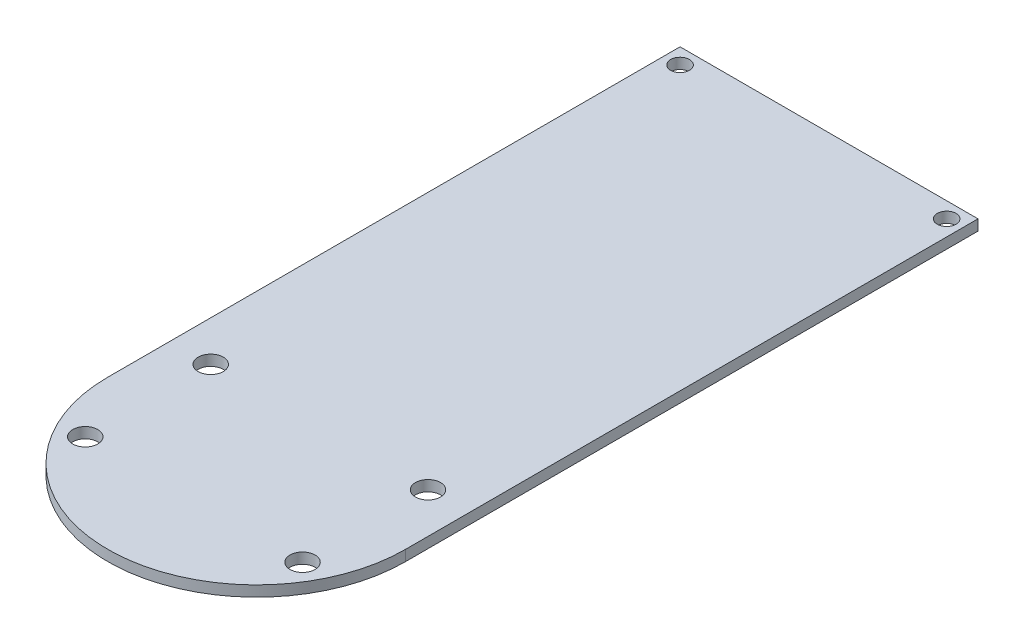
ISO-10303-21;
HEADER;
FILE_DESCRIPTION(('STEP AP214'),'2;1');
FILE_NAME('part.step','',(''),(''),'','','');
FILE_SCHEMA(('AUTOMOTIVE_DESIGN { 1 0 10303 214 1 1 1 1 }'));
ENDSEC;
DATA;
#1=APPLICATION_CONTEXT('core data for automotive mechanical design processes');
#2=APPLICATION_PROTOCOL_DEFINITION('international standard','automotive_design',2000,#1);
#3=PRODUCT_CONTEXT('',#1,'mechanical');
#4=PRODUCT('Part','Part','',(#3));
#5=PRODUCT_RELATED_PRODUCT_CATEGORY('part','',(#4));
#6=PRODUCT_DEFINITION_FORMATION('','',#4);
#7=PRODUCT_DEFINITION_CONTEXT('part definition',#1,'design');
#8=PRODUCT_DEFINITION('design','',#6,#7);
#9=PRODUCT_DEFINITION_SHAPE('','',#8);
#10=(LENGTH_UNIT() NAMED_UNIT(*) SI_UNIT(.MILLI.,.METRE.));
#11=(NAMED_UNIT(*) PLANE_ANGLE_UNIT() SI_UNIT($,.RADIAN.));
#12=(NAMED_UNIT(*) SI_UNIT($,.STERADIAN.) SOLID_ANGLE_UNIT());
#13=UNCERTAINTY_MEASURE_WITH_UNIT(LENGTH_MEASURE(1.E-05),#10,'distance_accuracy_value','');
#14=(GEOMETRIC_REPRESENTATION_CONTEXT(3) GLOBAL_UNCERTAINTY_ASSIGNED_CONTEXT((#13)) GLOBAL_UNIT_ASSIGNED_CONTEXT((#10,
#11,#12)) REPRESENTATION_CONTEXT('',''));
#15=CARTESIAN_POINT('',(0.,0.,0.));
#16=DIRECTION('',(0.,0.,1.));
#17=DIRECTION('',(1.,0.,0.));
#18=AXIS2_PLACEMENT_3D('',#15,#16,#17);
#19=CARTESIAN_POINT('',(0.,0.,45.625));
#20=DIRECTION('',(0.,1.,0.));
#21=DIRECTION('',(0.,0.,1.));
#22=AXIS2_PLACEMENT_3D('',#19,#20,#21);
#23=PLANE('',#22);
#24=CARTESIAN_POINT('',(-17.3205080756864,0.,35.6250000000042));
#25=DIRECTION('',(0.,1.,0.));
#26=DIRECTION('',(0.,0.,1.));
#27=AXIS2_PLACEMENT_3D('',#24,#25,#26);
#28=CIRCLE('',#27,2.);
#29=CARTESIAN_POINT('',(-17.3205080756864,0.,37.6250000000042));
#30=VERTEX_POINT('',#29);
#31=EDGE_CURVE('E146',#30,#30,#28,.T.);
#32=ORIENTED_EDGE('',*,*,#31,.T.);
#33=EDGE_LOOP('',(#32));
#34=FACE_BOUND('',#33,.T.);
#35=CARTESIAN_POINT('',(-17.3205080756815,0.,55.6250000000042));
#36=DIRECTION('',(0.,1.,0.));
#37=DIRECTION('',(0.,0.,1.));
#38=AXIS2_PLACEMENT_3D('',#35,#36,#37);
#39=CIRCLE('',#38,2.00000000000001);
#40=CARTESIAN_POINT('',(-17.3205080756815,0.,57.6250000000042));
#41=VERTEX_POINT('',#40);
#42=EDGE_CURVE('E156',#41,#41,#39,.T.);
#43=ORIENTED_EDGE('',*,*,#42,.T.);
#44=EDGE_LOOP('',(#43));
#45=FACE_BOUND('',#44,.T.);
#46=CARTESIAN_POINT('',(21.25,0.,-43.125));
#47=DIRECTION('',(0.,1.,0.));
#48=DIRECTION('',(0.,0.,-1.));
#49=AXIS2_PLACEMENT_3D('',#46,#47,#48);
#50=CIRCLE('',#49,1.5);
#51=CARTESIAN_POINT('',(21.25,0.,-44.625));
#52=VERTEX_POINT('',#51);
#53=EDGE_CURVE('E161',#52,#52,#50,.T.);
#54=ORIENTED_EDGE('',*,*,#53,.T.);
#55=EDGE_LOOP('',(#54));
#56=FACE_BOUND('',#55,.T.);
#57=CARTESIAN_POINT('',(17.320508075696,0.,55.6249999999958));
#58=DIRECTION('',(0.,1.,0.));
#59=DIRECTION('',(0.,0.,1.));
#60=AXIS2_PLACEMENT_3D('',#57,#58,#59);
#61=CIRCLE('',#60,2.);
#62=CARTESIAN_POINT('',(17.320508075696,0.,57.6249999999958));
#63=VERTEX_POINT('',#62);
#64=EDGE_CURVE('E167',#63,#63,#61,.T.);
#65=ORIENTED_EDGE('',*,*,#64,.T.);
#66=EDGE_LOOP('',(#65));
#67=FACE_BOUND('',#66,.T.);
#68=CARTESIAN_POINT('',(17.3205080756912,0.,35.6249999999958));
#69=DIRECTION('',(0.,1.,0.));
#70=DIRECTION('',(0.,0.,1.));
#71=AXIS2_PLACEMENT_3D('',#68,#69,#70);
#72=CIRCLE('',#71,2.00000000000001);
#73=CARTESIAN_POINT('',(17.3205080756912,0.,37.6249999999958));
#74=VERTEX_POINT('',#73);
#75=EDGE_CURVE('E173',#74,#74,#72,.T.);
#76=ORIENTED_EDGE('',*,*,#75,.T.);
#77=EDGE_LOOP('',(#76));
#78=FACE_BOUND('',#77,.T.);
#79=CARTESIAN_POINT('',(-21.25,0.,-43.125));
#80=DIRECTION('',(0.,1.,0.));
#81=DIRECTION('',(0.,0.,1.));
#82=AXIS2_PLACEMENT_3D('',#79,#80,#81);
#83=CIRCLE('',#82,1.5);
#84=CARTESIAN_POINT('',(-21.25,0.,-41.625));
#85=VERTEX_POINT('',#84);
#86=EDGE_CURVE('E179',#85,#85,#83,.T.);
#87=ORIENTED_EDGE('',*,*,#86,.T.);
#88=EDGE_LOOP('',(#87));
#89=FACE_BOUND('',#88,.T.);
#90=DIRECTION('',(0.,0.,1.));
#91=VECTOR('',#90,1.);
#92=CARTESIAN_POINT('',(-23.75,0.,-45.625));
#93=LINE('',#92,#91);
#94=CARTESIAN_POINT('',(-23.75,0.,-45.625));
#95=VERTEX_POINT('',#94);
#96=CARTESIAN_POINT('',(-23.75,0.,45.625));
#97=VERTEX_POINT('',#96);
#98=EDGE_CURVE('E185',#95,#97,#93,.T.);
#99=ORIENTED_EDGE('',*,*,#98,.F.);
#100=DIRECTION('',(-1.,0.,0.));
#101=VECTOR('',#100,1.);
#102=CARTESIAN_POINT('',(-23.75,0.,-45.625));
#103=LINE('',#102,#101);
#104=CARTESIAN_POINT('',(23.75,0.,-45.625));
#105=VERTEX_POINT('',#104);
#106=EDGE_CURVE('E192',#105,#95,#103,.T.);
#107=ORIENTED_EDGE('',*,*,#106,.F.);
#108=DIRECTION('',(0.,0.,-1.));
#109=VECTOR('',#108,1.);
#110=CARTESIAN_POINT('',(23.75,0.,-45.625));
#111=LINE('',#110,#109);
#112=CARTESIAN_POINT('',(23.75,0.,45.625));
#113=VERTEX_POINT('',#112);
#114=EDGE_CURVE('E203',#113,#105,#111,.T.);
#115=ORIENTED_EDGE('',*,*,#114,.F.);
#116=CARTESIAN_POINT('',(0.,0.,45.625));
#117=DIRECTION('',(0.,1.,0.));
#118=DIRECTION('',(0.,0.,1.));
#119=AXIS2_PLACEMENT_3D('',#116,#117,#118);
#120=CIRCLE('',#119,23.75);
#121=EDGE_CURVE('E201',#97,#113,#120,.T.);
#122=ORIENTED_EDGE('',*,*,#121,.F.);
#123=EDGE_LOOP('',(#99,#107,#115,#122));
#124=FACE_BOUND('',#123,.T.);
#125=DIRECTION('',(-1.,0.,0.));
#126=VECTOR('',#125,1.);
#127=CARTESIAN_POINT('',(-2.15,0.,48.835));
#128=LINE('',#127,#126);
#129=CARTESIAN_POINT('',(2.84999999999999,0.,48.835));
#130=VERTEX_POINT('',#129);
#131=CARTESIAN_POINT('',(-2.84999999999999,0.,48.835));
#132=VERTEX_POINT('',#131);
#133=EDGE_CURVE('E234',#130,#132,#128,.T.);
#134=ORIENTED_EDGE('',*,*,#133,.F.);
#135=DIRECTION('',(0.,0.,-1.));
#136=VECTOR('',#135,1.);
#137=CARTESIAN_POINT('',(2.84999999999999,0.,43.665));
#138=LINE('',#137,#136);
#139=CARTESIAN_POINT('',(2.84999999999999,0.,43.665));
#140=VERTEX_POINT('',#139);
#141=EDGE_CURVE('E221',#130,#140,#138,.T.);
#142=ORIENTED_EDGE('',*,*,#141,.T.);
#143=DIRECTION('',(1.,0.,0.));
#144=VECTOR('',#143,1.);
#145=CARTESIAN_POINT('',(-2.15,0.,43.665));
#146=LINE('',#145,#144);
#147=CARTESIAN_POINT('',(-2.84999999999999,0.,43.665));
#148=VERTEX_POINT('',#147);
#149=EDGE_CURVE('E140',#148,#140,#146,.T.);
#150=ORIENTED_EDGE('',*,*,#149,.F.);
#151=DIRECTION('',(0.,0.,1.));
#152=VECTOR('',#151,1.);
#153=CARTESIAN_POINT('',(-2.84999999999999,0.,48.835));
#154=LINE('',#153,#152);
#155=EDGE_CURVE('E218',#148,#132,#154,.T.);
#156=ORIENTED_EDGE('',*,*,#155,.T.);
#157=EDGE_LOOP('',(#134,#142,#150,#156));
#158=FACE_BOUND('',#157,.T.);
#159=ADVANCED_FACE('F45',(#34,#45,#56,#67,#78,#89,#124,#158),#23,.F.);
#160=CARTESIAN_POINT('',(0.,1.7,45.625));
#161=DIRECTION('',(0.,1.,0.));
#162=DIRECTION('',(0.,0.,1.));
#163=AXIS2_PLACEMENT_3D('',#160,#161,#162);
#164=PLANE('',#163);
#165=CARTESIAN_POINT('',(-17.3205080756815,1.7,55.6250000000042));
#166=DIRECTION('',(0.,1.,0.));
#167=DIRECTION('',(0.,0.,1.));
#168=AXIS2_PLACEMENT_3D('',#165,#166,#167);
#169=CIRCLE('',#168,2.00000000000001);
#170=CARTESIAN_POINT('',(-17.3205080756815,1.7,57.6250000000042));
#171=VERTEX_POINT('',#170);
#172=EDGE_CURVE('E158',#171,#171,#169,.T.);
#173=ORIENTED_EDGE('',*,*,#172,.F.);
#174=EDGE_LOOP('',(#173));
#175=FACE_BOUND('',#174,.T.);
#176=CARTESIAN_POINT('',(17.320508075696,1.7,55.6249999999958));
#177=DIRECTION('',(0.,1.,0.));
#178=DIRECTION('',(0.,0.,1.));
#179=AXIS2_PLACEMENT_3D('',#176,#177,#178);
#180=CIRCLE('',#179,2.);
#181=CARTESIAN_POINT('',(17.320508075696,1.7,57.6249999999958));
#182=VERTEX_POINT('',#181);
#183=EDGE_CURVE('E170',#182,#182,#180,.T.);
#184=ORIENTED_EDGE('',*,*,#183,.F.);
#185=EDGE_LOOP('',(#184));
#186=FACE_BOUND('',#185,.T.);
#187=CARTESIAN_POINT('',(-21.25,1.7,-43.125));
#188=DIRECTION('',(0.,1.,0.));
#189=DIRECTION('',(0.,0.,1.));
#190=AXIS2_PLACEMENT_3D('',#187,#188,#189);
#191=CIRCLE('',#190,1.5);
#192=CARTESIAN_POINT('',(-21.25,1.7,-41.625));
#193=VERTEX_POINT('',#192);
#194=EDGE_CURVE('E182',#193,#193,#191,.T.);
#195=ORIENTED_EDGE('',*,*,#194,.F.);
#196=EDGE_LOOP('',(#195));
#197=FACE_BOUND('',#196,.T.);
#198=DIRECTION('',(0.,0.,1.));
#199=VECTOR('',#198,1.);
#200=CARTESIAN_POINT('',(-23.75,1.7,-45.625));
#201=LINE('',#200,#199);
#202=CARTESIAN_POINT('',(-23.75,1.7,-45.625));
#203=VERTEX_POINT('',#202);
#204=CARTESIAN_POINT('',(-23.75,1.7,45.625));
#205=VERTEX_POINT('',#204);
#206=EDGE_CURVE('E188',#203,#205,#201,.T.);
#207=ORIENTED_EDGE('',*,*,#206,.T.);
#208=CARTESIAN_POINT('',(0.,1.7,45.625));
#209=DIRECTION('',(0.,1.,0.));
#210=DIRECTION('',(0.,0.,1.));
#211=AXIS2_PLACEMENT_3D('',#208,#209,#210);
#212=CIRCLE('',#211,23.75);
#213=CARTESIAN_POINT('',(23.75,1.7,45.625));
#214=VERTEX_POINT('',#213);
#215=EDGE_CURVE('E191',#205,#214,#212,.T.);
#216=ORIENTED_EDGE('',*,*,#215,.T.);
#217=DIRECTION('',(0.,0.,-1.));
#218=VECTOR('',#217,1.);
#219=CARTESIAN_POINT('',(23.75,1.7,-45.625));
#220=LINE('',#219,#218);
#221=CARTESIAN_POINT('',(23.75,1.7,-45.625));
#222=VERTEX_POINT('',#221);
#223=EDGE_CURVE('E194',#214,#222,#220,.T.);
#224=ORIENTED_EDGE('',*,*,#223,.T.);
#225=DIRECTION('',(-1.,0.,0.));
#226=VECTOR('',#225,1.);
#227=CARTESIAN_POINT('',(-23.75,1.7,-45.625));
#228=LINE('',#227,#226);
#229=EDGE_CURVE('E196',#222,#203,#228,.T.);
#230=ORIENTED_EDGE('',*,*,#229,.T.);
#231=EDGE_LOOP('',(#207,#216,#224,#230));
#232=FACE_BOUND('',#231,.T.);
#233=CARTESIAN_POINT('',(17.3205080756912,1.7,35.6249999999958));
#234=DIRECTION('',(0.,1.,0.));
#235=DIRECTION('',(0.,0.,1.));
#236=AXIS2_PLACEMENT_3D('',#233,#234,#235);
#237=CIRCLE('',#236,2.00000000000001);
#238=CARTESIAN_POINT('',(17.3205080756912,1.7,37.6249999999958));
#239=VERTEX_POINT('',#238);
#240=EDGE_CURVE('E176',#239,#239,#237,.T.);
#241=ORIENTED_EDGE('',*,*,#240,.F.);
#242=EDGE_LOOP('',(#241));
#243=FACE_BOUND('',#242,.T.);
#244=CARTESIAN_POINT('',(21.25,1.7,-43.125));
#245=DIRECTION('',(0.,1.,0.));
#246=DIRECTION('',(0.,0.,-1.));
#247=AXIS2_PLACEMENT_3D('',#244,#245,#246);
#248=CIRCLE('',#247,1.5);
#249=CARTESIAN_POINT('',(21.25,1.7,-44.625));
#250=VERTEX_POINT('',#249);
#251=EDGE_CURVE('E164',#250,#250,#248,.T.);
#252=ORIENTED_EDGE('',*,*,#251,.F.);
#253=EDGE_LOOP('',(#252));
#254=FACE_BOUND('',#253,.T.);
#255=CARTESIAN_POINT('',(-17.3205080756864,1.7,35.6250000000042));
#256=DIRECTION('',(0.,1.,0.));
#257=DIRECTION('',(0.,0.,1.));
#258=AXIS2_PLACEMENT_3D('',#255,#256,#257);
#259=CIRCLE('',#258,2.);
#260=CARTESIAN_POINT('',(-17.3205080756864,1.7,37.6250000000042));
#261=VERTEX_POINT('',#260);
#262=EDGE_CURVE('E149',#261,#261,#259,.T.);
#263=ORIENTED_EDGE('',*,*,#262,.F.);
#264=EDGE_LOOP('',(#263));
#265=FACE_BOUND('',#264,.T.);
#266=ADVANCED_FACE('F256',(#175,#186,#197,#232,#243,#254,#265),#164,.T.);
#267=CARTESIAN_POINT('',(-23.75,1.7,-45.625));
#268=DIRECTION('',(1.,0.,0.));
#269=DIRECTION('',(0.,0.,-1.));
#270=AXIS2_PLACEMENT_3D('',#267,#268,#269);
#271=PLANE('',#270);
#272=ORIENTED_EDGE('',*,*,#98,.T.);
#273=DIRECTION('',(0.,-1.,0.));
#274=VECTOR('',#273,1.);
#275=CARTESIAN_POINT('',(-23.75,1.7,45.625));
#276=LINE('',#275,#274);
#277=EDGE_CURVE('E214',#205,#97,#276,.T.);
#278=ORIENTED_EDGE('',*,*,#277,.F.);
#279=ORIENTED_EDGE('',*,*,#206,.F.);
#280=DIRECTION('',(0.,-1.,0.));
#281=VECTOR('',#280,1.);
#282=CARTESIAN_POINT('',(-23.75,1.7,-45.625));
#283=LINE('',#282,#281);
#284=EDGE_CURVE('E198',#203,#95,#283,.T.);
#285=ORIENTED_EDGE('',*,*,#284,.T.);
#286=EDGE_LOOP('',(#272,#278,#279,#285));
#287=FACE_BOUND('',#286,.T.);
#288=ADVANCED_FACE('F262',(#287),#271,.F.);
#289=CARTESIAN_POINT('',(0.,1.7,45.625));
#290=DIRECTION('',(0.,-1.,0.));
#291=DIRECTION('',(0.,0.,-1.));
#292=AXIS2_PLACEMENT_3D('',#289,#290,#291);
#293=CYLINDRICAL_SURFACE('',#292,23.75);
#294=ORIENTED_EDGE('',*,*,#121,.T.);
#295=DIRECTION('',(0.,-1.,0.));
#296=VECTOR('',#295,1.);
#297=CARTESIAN_POINT('',(23.75,1.7,45.625));
#298=LINE('',#297,#296);
#299=EDGE_CURVE('E211',#214,#113,#298,.T.);
#300=ORIENTED_EDGE('',*,*,#299,.F.);
#301=ORIENTED_EDGE('',*,*,#215,.F.);
#302=ORIENTED_EDGE('',*,*,#277,.T.);
#303=EDGE_LOOP('',(#294,#300,#301,#302));
#304=FACE_BOUND('',#303,.T.);
#305=ADVANCED_FACE('F276',(#304),#293,.T.);
#306=CARTESIAN_POINT('',(23.75,1.7,-45.625));
#307=DIRECTION('',(-1.,0.,0.));
#308=DIRECTION('',(0.,0.,1.));
#309=AXIS2_PLACEMENT_3D('',#306,#307,#308);
#310=PLANE('',#309);
#311=ORIENTED_EDGE('',*,*,#114,.T.);
#312=DIRECTION('',(0.,-1.,0.));
#313=VECTOR('',#312,1.);
#314=CARTESIAN_POINT('',(23.75,1.7,-45.625));
#315=LINE('',#314,#313);
#316=EDGE_CURVE('E208',#222,#105,#315,.T.);
#317=ORIENTED_EDGE('',*,*,#316,.F.);
#318=ORIENTED_EDGE('',*,*,#223,.F.);
#319=ORIENTED_EDGE('',*,*,#299,.T.);
#320=EDGE_LOOP('',(#311,#317,#318,#319));
#321=FACE_BOUND('',#320,.T.);
#322=ADVANCED_FACE('F272',(#321),#310,.F.);
#323=CARTESIAN_POINT('',(-23.75,1.7,-45.625));
#324=DIRECTION('',(0.,0.,1.));
#325=DIRECTION('',(1.,0.,0.));
#326=AXIS2_PLACEMENT_3D('',#323,#324,#325);
#327=PLANE('',#326);
#328=ORIENTED_EDGE('',*,*,#106,.T.);
#329=ORIENTED_EDGE('',*,*,#284,.F.);
#330=ORIENTED_EDGE('',*,*,#229,.F.);
#331=ORIENTED_EDGE('',*,*,#316,.T.);
#332=EDGE_LOOP('',(#328,#329,#330,#331));
#333=FACE_BOUND('',#332,.T.);
#334=ADVANCED_FACE('F268',(#333),#327,.F.);
#335=CARTESIAN_POINT('',(-21.25,1.7,-43.125));
#336=DIRECTION('',(0.,-1.,0.));
#337=DIRECTION('',(0.,0.,-1.));
#338=AXIS2_PLACEMENT_3D('',#335,#336,#337);
#339=CYLINDRICAL_SURFACE('',#338,1.5);
#340=ORIENTED_EDGE('',*,*,#194,.T.);
#341=EDGE_LOOP('',(#340));
#342=FACE_BOUND('',#341,.T.);
#343=ORIENTED_EDGE('',*,*,#86,.F.);
#344=EDGE_LOOP('',(#343));
#345=FACE_BOUND('',#344,.T.);
#346=ADVANCED_FACE('F271',(#342,#345),#339,.F.);
#347=CARTESIAN_POINT('',(17.3205080756912,1.7,35.6249999999958));
#348=DIRECTION('',(0.,-1.,0.));
#349=DIRECTION('',(0.,0.,-1.));
#350=AXIS2_PLACEMENT_3D('',#347,#348,#349);
#351=CYLINDRICAL_SURFACE('',#350,2.00000000000001);
#352=ORIENTED_EDGE('',*,*,#240,.T.);
#353=EDGE_LOOP('',(#352));
#354=FACE_BOUND('',#353,.T.);
#355=ORIENTED_EDGE('',*,*,#75,.F.);
#356=EDGE_LOOP('',(#355));
#357=FACE_BOUND('',#356,.T.);
#358=ADVANCED_FACE('F325',(#354,#357),#351,.F.);
#359=CARTESIAN_POINT('',(17.320508075696,1.7,55.6249999999958));
#360=DIRECTION('',(0.,-1.,0.));
#361=DIRECTION('',(0.,0.,-1.));
#362=AXIS2_PLACEMENT_3D('',#359,#360,#361);
#363=CYLINDRICAL_SURFACE('',#362,2.);
#364=ORIENTED_EDGE('',*,*,#183,.T.);
#365=EDGE_LOOP('',(#364));
#366=FACE_BOUND('',#365,.T.);
#367=ORIENTED_EDGE('',*,*,#64,.F.);
#368=EDGE_LOOP('',(#367));
#369=FACE_BOUND('',#368,.T.);
#370=ADVANCED_FACE('F321',(#366,#369),#363,.F.);
#371=CARTESIAN_POINT('',(21.25,1.7,-43.125));
#372=DIRECTION('',(0.,-1.,0.));
#373=DIRECTION('',(0.,0.,-1.));
#374=AXIS2_PLACEMENT_3D('',#371,#372,#373);
#375=CYLINDRICAL_SURFACE('',#374,1.5);
#376=ORIENTED_EDGE('',*,*,#251,.T.);
#377=EDGE_LOOP('',(#376));
#378=FACE_BOUND('',#377,.T.);
#379=ORIENTED_EDGE('',*,*,#53,.F.);
#380=EDGE_LOOP('',(#379));
#381=FACE_BOUND('',#380,.T.);
#382=ADVANCED_FACE('F314',(#378,#381),#375,.F.);
#383=CARTESIAN_POINT('',(-17.3205080756815,1.7,55.6250000000042));
#384=DIRECTION('',(0.,-1.,0.));
#385=DIRECTION('',(0.,0.,-1.));
#386=AXIS2_PLACEMENT_3D('',#383,#384,#385);
#387=CYLINDRICAL_SURFACE('',#386,2.00000000000001);
#388=ORIENTED_EDGE('',*,*,#172,.T.);
#389=EDGE_LOOP('',(#388));
#390=FACE_BOUND('',#389,.T.);
#391=ORIENTED_EDGE('',*,*,#42,.F.);
#392=EDGE_LOOP('',(#391));
#393=FACE_BOUND('',#392,.T.);
#394=ADVANCED_FACE('F306',(#390,#393),#387,.F.);
#395=CARTESIAN_POINT('',(-17.3205080756864,1.7,35.6250000000042));
#396=DIRECTION('',(0.,-1.,0.));
#397=DIRECTION('',(0.,0.,-1.));
#398=AXIS2_PLACEMENT_3D('',#395,#396,#397);
#399=CYLINDRICAL_SURFACE('',#398,2.);
#400=ORIENTED_EDGE('',*,*,#262,.T.);
#401=EDGE_LOOP('',(#400));
#402=FACE_BOUND('',#401,.T.);
#403=ORIENTED_EDGE('',*,*,#31,.F.);
#404=EDGE_LOOP('',(#403));
#405=FACE_BOUND('',#404,.T.);
#406=ADVANCED_FACE('F303',(#402,#405),#399,.F.);
#407=CARTESIAN_POINT('',(2.15,-0.9,43.665));
#408=DIRECTION('',(-1.,0.,0.));
#409=DIRECTION('',(0.,0.,1.));
#410=AXIS2_PLACEMENT_3D('',#407,#408,#409);
#411=PLANE('',#410);
#412=DIRECTION('',(0.,1.,0.));
#413=VECTOR('',#412,1.);
#414=CARTESIAN_POINT('',(2.15,-0.9,43.665));
#415=LINE('',#414,#413);
#416=CARTESIAN_POINT('',(2.15,-0.9,43.665));
#417=VERTEX_POINT('',#416);
#418=CARTESIAN_POINT('',(2.15,-0.700000000000006,43.665));
#419=VERTEX_POINT('',#418);
#420=EDGE_CURVE('E241',#417,#419,#415,.T.);
#421=ORIENTED_EDGE('',*,*,#420,.T.);
#422=DIRECTION('',(0.,0.,1.));
#423=VECTOR('',#422,1.);
#424=CARTESIAN_POINT('',(2.15,-0.700000000000006,48.835));
#425=LINE('',#424,#423);
#426=CARTESIAN_POINT('',(2.15,-0.700000000000006,48.835));
#427=VERTEX_POINT('',#426);
#428=EDGE_CURVE('E145',#419,#427,#425,.T.);
#429=ORIENTED_EDGE('',*,*,#428,.T.);
#430=DIRECTION('',(0.,1.,0.));
#431=VECTOR('',#430,1.);
#432=CARTESIAN_POINT('',(2.15,-0.9,48.835));
#433=LINE('',#432,#431);
#434=CARTESIAN_POINT('',(2.15,-0.9,48.835));
#435=VERTEX_POINT('',#434);
#436=EDGE_CURVE('E126',#435,#427,#433,.T.);
#437=ORIENTED_EDGE('',*,*,#436,.F.);
#438=DIRECTION('',(0.,0.,1.));
#439=VECTOR('',#438,1.);
#440=CARTESIAN_POINT('',(2.15,-0.9,43.665));
#441=LINE('',#440,#439);
#442=EDGE_CURVE('E131',#417,#435,#441,.T.);
#443=ORIENTED_EDGE('',*,*,#442,.F.);
#444=EDGE_LOOP('',(#421,#429,#437,#443));
#445=FACE_BOUND('',#444,.T.);
#446=ADVANCED_FACE('F143',(#445),#411,.F.);
#447=CARTESIAN_POINT('',(-2.15,-0.9,48.835));
#448=DIRECTION('',(0.,0.,-1.));
#449=DIRECTION('',(-1.,0.,0.));
#450=AXIS2_PLACEMENT_3D('',#447,#448,#449);
#451=PLANE('',#450);
#452=ORIENTED_EDGE('',*,*,#133,.T.);
#453=DIRECTION('',(-0.707106781186541,0.707106781186555,0.));
#454=VECTOR('',#453,1.);
#455=CARTESIAN_POINT('',(-2.05,-0.800000000000005,48.835));
#456=LINE('',#455,#454);
#457=CARTESIAN_POINT('',(-2.15,-0.700000000000006,48.835));
#458=VERTEX_POINT('',#457);
#459=EDGE_CURVE('E11',#132,#458,#456,.F.);
#460=ORIENTED_EDGE('',*,*,#459,.T.);
#461=DIRECTION('',(0.,1.,0.));
#462=VECTOR('',#461,1.);
#463=CARTESIAN_POINT('',(-2.15,-0.9,48.835));
#464=LINE('',#463,#462);
#465=CARTESIAN_POINT('',(-2.15,-0.9,48.835));
#466=VERTEX_POINT('',#465);
#467=EDGE_CURVE('E127',#466,#458,#464,.T.);
#468=ORIENTED_EDGE('',*,*,#467,.F.);
#469=DIRECTION('',(-1.,0.,0.));
#470=VECTOR('',#469,1.);
#471=CARTESIAN_POINT('',(-2.15,-0.9,48.835));
#472=LINE('',#471,#470);
#473=EDGE_CURVE('E121',#435,#466,#472,.T.);
#474=ORIENTED_EDGE('',*,*,#473,.F.);
#475=ORIENTED_EDGE('',*,*,#436,.T.);
#476=DIRECTION('',(-0.707106781186541,-0.707106781186555,0.));
#477=VECTOR('',#476,1.);
#478=CARTESIAN_POINT('',(-0.0999999999999547,-2.95,48.835));
#479=LINE('',#478,#477);
#480=EDGE_CURVE('E226',#427,#130,#479,.F.);
#481=ORIENTED_EDGE('',*,*,#480,.T.);
#482=EDGE_LOOP('',(#452,#460,#468,#474,#475,#481));
#483=FACE_BOUND('',#482,.T.);
#484=ADVANCED_FACE('F123',(#483),#451,.F.);
#485=CARTESIAN_POINT('',(-2.15,-0.9,43.665));
#486=DIRECTION('',(1.,0.,0.));
#487=DIRECTION('',(0.,0.,-1.));
#488=AXIS2_PLACEMENT_3D('',#485,#486,#487);
#489=PLANE('',#488);
#490=ORIENTED_EDGE('',*,*,#467,.T.);
#491=DIRECTION('',(0.,0.,-1.));
#492=VECTOR('',#491,1.);
#493=CARTESIAN_POINT('',(-2.15,-0.700000000000006,43.665));
#494=LINE('',#493,#492);
#495=CARTESIAN_POINT('',(-2.15,-0.700000000000006,43.665));
#496=VERTEX_POINT('',#495);
#497=EDGE_CURVE('E224',#458,#496,#494,.T.);
#498=ORIENTED_EDGE('',*,*,#497,.T.);
#499=DIRECTION('',(0.,1.,0.));
#500=VECTOR('',#499,1.);
#501=CARTESIAN_POINT('',(-2.15,-0.9,43.665));
#502=LINE('',#501,#500);
#503=CARTESIAN_POINT('',(-2.15,-0.9,43.665));
#504=VERTEX_POINT('',#503);
#505=EDGE_CURVE('E151',#504,#496,#502,.T.);
#506=ORIENTED_EDGE('',*,*,#505,.F.);
#507=DIRECTION('',(0.,0.,-1.));
#508=VECTOR('',#507,1.);
#509=CARTESIAN_POINT('',(-2.15,-0.9,43.665));
#510=LINE('',#509,#508);
#511=EDGE_CURVE('E130',#466,#504,#510,.T.);
#512=ORIENTED_EDGE('',*,*,#511,.F.);
#513=EDGE_LOOP('',(#490,#498,#506,#512));
#514=FACE_BOUND('',#513,.T.);
#515=ADVANCED_FACE('F244',(#514),#489,.F.);
#516=CARTESIAN_POINT('',(-2.15,-0.9,43.665));
#517=DIRECTION('',(0.,0.,1.));
#518=DIRECTION('',(1.,0.,0.));
#519=AXIS2_PLACEMENT_3D('',#516,#517,#518);
#520=PLANE('',#519);
#521=ORIENTED_EDGE('',*,*,#149,.T.);
#522=DIRECTION('',(0.707106781186541,0.707106781186555,0.));
#523=VECTOR('',#522,1.);
#524=CARTESIAN_POINT('',(-0.0999999999999547,-2.95,43.665));
#525=LINE('',#524,#523);
#526=EDGE_CURVE('E228',#140,#419,#525,.F.);
#527=ORIENTED_EDGE('',*,*,#526,.T.);
#528=ORIENTED_EDGE('',*,*,#420,.F.);
#529=DIRECTION('',(1.,0.,0.));
#530=VECTOR('',#529,1.);
#531=CARTESIAN_POINT('',(-2.15,-0.9,43.665));
#532=LINE('',#531,#530);
#533=EDGE_CURVE('E136',#504,#417,#532,.T.);
#534=ORIENTED_EDGE('',*,*,#533,.F.);
#535=ORIENTED_EDGE('',*,*,#505,.T.);
#536=DIRECTION('',(0.707106781186541,-0.707106781186555,0.));
#537=VECTOR('',#536,1.);
#538=CARTESIAN_POINT('',(-2.05,-0.800000000000005,43.665));
#539=LINE('',#538,#537);
#540=EDGE_CURVE('E54',#496,#148,#539,.F.);
#541=ORIENTED_EDGE('',*,*,#540,.T.);
#542=EDGE_LOOP('',(#521,#527,#528,#534,#535,#541));
#543=FACE_BOUND('',#542,.T.);
#544=ADVANCED_FACE('F231',(#543),#520,.F.);
#545=CARTESIAN_POINT('',(0.,-0.9,0.));
#546=DIRECTION('',(0.,1.,0.));
#547=DIRECTION('',(0.,0.,1.));
#548=AXIS2_PLACEMENT_3D('',#545,#546,#547);
#549=PLANE('',#548);
#550=ORIENTED_EDGE('',*,*,#442,.T.);
#551=ORIENTED_EDGE('',*,*,#473,.T.);
#552=ORIENTED_EDGE('',*,*,#511,.T.);
#553=ORIENTED_EDGE('',*,*,#533,.T.);
#554=EDGE_LOOP('',(#550,#551,#552,#553));
#555=FACE_BOUND('',#554,.T.);
#556=ADVANCED_FACE('F134',(#555),#549,.F.);
#557=CARTESIAN_POINT('',(2.15,-0.700000000000006,43.665));
#558=DIRECTION('',(0.707106781186554,-0.70710678118654,0.));
#559=DIRECTION('',(0.,0.,-1.));
#560=AXIS2_PLACEMENT_3D('',#557,#558,#559);
#561=PLANE('',#560);
#562=ORIENTED_EDGE('',*,*,#526,.F.);
#563=ORIENTED_EDGE('',*,*,#141,.F.);
#564=ORIENTED_EDGE('',*,*,#480,.F.);
#565=ORIENTED_EDGE('',*,*,#428,.F.);
#566=EDGE_LOOP('',(#562,#563,#564,#565));
#567=FACE_BOUND('',#566,.T.);
#568=ADVANCED_FACE('F246',(#567),#561,.T.);
#569=CARTESIAN_POINT('',(-2.15,-0.700000000000006,43.665));
#570=DIRECTION('',(-0.707106781186554,-0.70710678118654,0.));
#571=DIRECTION('',(0.,0.,1.));
#572=AXIS2_PLACEMENT_3D('',#569,#570,#571);
#573=PLANE('',#572);
#574=ORIENTED_EDGE('',*,*,#459,.F.);
#575=ORIENTED_EDGE('',*,*,#155,.F.);
#576=ORIENTED_EDGE('',*,*,#540,.F.);
#577=ORIENTED_EDGE('',*,*,#497,.F.);
#578=EDGE_LOOP('',(#574,#575,#576,#577));
#579=FACE_BOUND('',#578,.T.);
#580=ADVANCED_FACE('F48',(#579),#573,.T.);
#581=CLOSED_SHELL('',(#159,#266,#288,#305,#322,#334,#346,#358,#370,#382,#394,#406,#446,#484,
#515,#544,#556,#568,#580));
#582=MANIFOLD_SOLID_BREP('B2',#581);
#583=ADVANCED_BREP_SHAPE_REPRESENTATION('',(#18,#582),#14);
#584=SHAPE_DEFINITION_REPRESENTATION(#9,#583);
ENDSEC;
END-ISO-10303-21;
